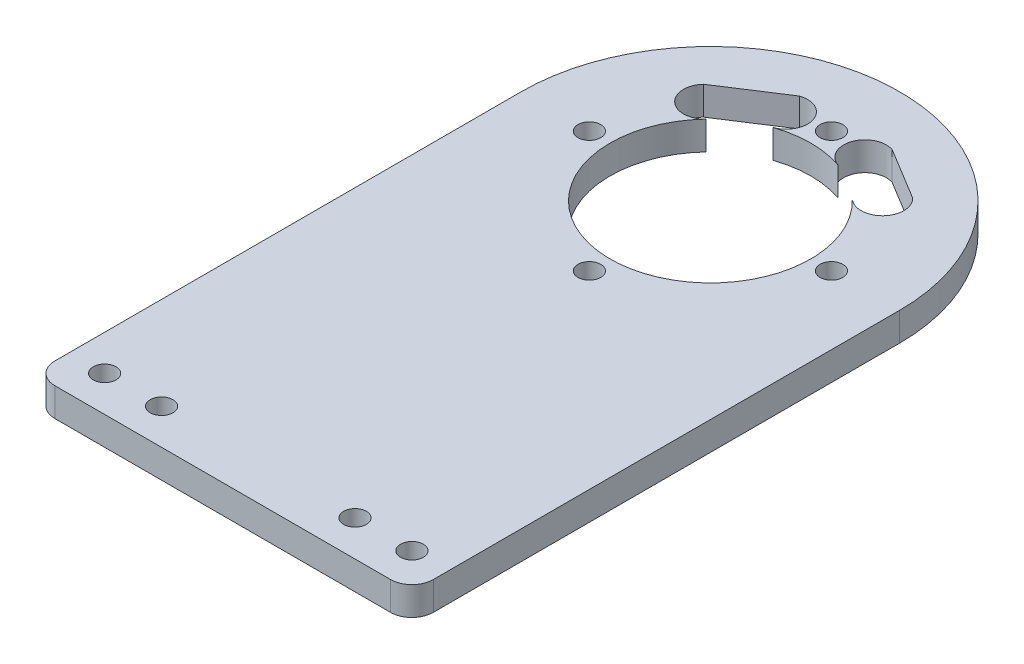
ISO-10303-21;
HEADER;
FILE_DESCRIPTION(('STEP AP214'),'2;1');
FILE_NAME('part.step','',(''),(''),'','','');
FILE_SCHEMA(('AUTOMOTIVE_DESIGN { 1 0 10303 214 1 1 1 1 }'));
ENDSEC;
DATA;
#1=APPLICATION_CONTEXT('core data for automotive mechanical design processes');
#2=APPLICATION_PROTOCOL_DEFINITION('international standard','automotive_design',2000,#1);
#3=PRODUCT_CONTEXT('',#1,'mechanical');
#4=PRODUCT('Part','Part','',(#3));
#5=PRODUCT_RELATED_PRODUCT_CATEGORY('part','',(#4));
#6=PRODUCT_DEFINITION_FORMATION('','',#4);
#7=PRODUCT_DEFINITION_CONTEXT('part definition',#1,'design');
#8=PRODUCT_DEFINITION('design','',#6,#7);
#9=PRODUCT_DEFINITION_SHAPE('','',#8);
#10=(LENGTH_UNIT() NAMED_UNIT(*) SI_UNIT(.MILLI.,.METRE.));
#11=(NAMED_UNIT(*) PLANE_ANGLE_UNIT() SI_UNIT($,.RADIAN.));
#12=(NAMED_UNIT(*) SI_UNIT($,.STERADIAN.) SOLID_ANGLE_UNIT());
#13=UNCERTAINTY_MEASURE_WITH_UNIT(LENGTH_MEASURE(1.E-05),#10,'distance_accuracy_value','');
#14=(GEOMETRIC_REPRESENTATION_CONTEXT(3) GLOBAL_UNCERTAINTY_ASSIGNED_CONTEXT((#13)) GLOBAL_UNIT_ASSIGNED_CONTEXT((#10,
#11,#12)) REPRESENTATION_CONTEXT('',''));
#15=CARTESIAN_POINT('',(0.,0.,0.));
#16=DIRECTION('',(0.,0.,1.));
#17=DIRECTION('',(1.,0.,0.));
#18=AXIS2_PLACEMENT_3D('',#15,#16,#17);
#19=CARTESIAN_POINT('',(0.,4.,0.));
#20=DIRECTION('',(0.,-1.,0.));
#21=DIRECTION('',(0.,0.,-1.));
#22=AXIS2_PLACEMENT_3D('',#19,#20,#21);
#23=PLANE('',#22);
#24=CARTESIAN_POINT('',(13.5802958728512,4.,63.5044260639932));
#25=DIRECTION('',(0.,-1.,0.));
#26=DIRECTION('',(0.,0.,-1.));
#27=AXIS2_PLACEMENT_3D('',#24,#25,#26);
#28=CIRCLE('',#27,1.6);
#29=CARTESIAN_POINT('',(13.5802958728512,4.,61.9044260639932));
#30=VERTEX_POINT('',#29);
#31=EDGE_CURVE('E496',#30,#30,#28,.T.);
#32=ORIENTED_EDGE('',*,*,#31,.T.);
#33=EDGE_LOOP('',(#32));
#34=FACE_BOUND('',#33,.T.);
#35=CARTESIAN_POINT('',(-13.5802958728512,4.,63.5044260639932));
#36=DIRECTION('',(0.,-1.,0.));
#37=DIRECTION('',(0.,0.,-1.));
#38=AXIS2_PLACEMENT_3D('',#35,#36,#37);
#39=CIRCLE('',#38,1.6);
#40=CARTESIAN_POINT('',(-13.5802958728512,4.,61.9044260639932));
#41=VERTEX_POINT('',#40);
#42=EDGE_CURVE('E498',#41,#41,#39,.T.);
#43=ORIENTED_EDGE('',*,*,#42,.T.);
#44=EDGE_LOOP('',(#43));
#45=FACE_BOUND('',#44,.T.);
#46=CARTESIAN_POINT('',(-21.5802958728512,4.,63.5044260639932));
#47=DIRECTION('',(0.,-1.,0.));
#48=DIRECTION('',(0.,0.,-1.));
#49=AXIS2_PLACEMENT_3D('',#46,#47,#48);
#50=CIRCLE('',#49,1.6);
#51=CARTESIAN_POINT('',(-21.5802958728512,4.,61.9044260639932));
#52=VERTEX_POINT('',#51);
#53=EDGE_CURVE('E504',#52,#52,#50,.T.);
#54=ORIENTED_EDGE('',*,*,#53,.T.);
#55=EDGE_LOOP('',(#54));
#56=FACE_BOUND('',#55,.T.);
#57=CARTESIAN_POINT('',(21.5802958728512,4.,63.5044260639932));
#58=DIRECTION('',(0.,-1.,0.));
#59=DIRECTION('',(0.,0.,-1.));
#60=AXIS2_PLACEMENT_3D('',#57,#58,#59);
#61=CIRCLE('',#60,1.6);
#62=CARTESIAN_POINT('',(21.5802958728512,4.,61.9044260639932));
#63=VERTEX_POINT('',#62);
#64=EDGE_CURVE('E501',#63,#63,#61,.T.);
#65=ORIENTED_EDGE('',*,*,#64,.T.);
#66=EDGE_LOOP('',(#65));
#67=FACE_BOUND('',#66,.T.);
#68=DIRECTION('',(0.,0.,1.));
#69=VECTOR('',#68,1.);
#70=CARTESIAN_POINT('',(-26.5802958728512,4.,0.));
#71=LINE('',#70,#69);
#72=CARTESIAN_POINT('',(-26.5802958728512,4.,0.));
#73=VERTEX_POINT('',#72);
#74=CARTESIAN_POINT('',(-26.5802958728512,4.,65.5044260639932));
#75=VERTEX_POINT('',#74);
#76=EDGE_CURVE('E219',#73,#75,#71,.T.);
#77=ORIENTED_EDGE('',*,*,#76,.T.);
#78=CARTESIAN_POINT('',(-23.5802958728512,4.,65.5044260639932));
#79=DIRECTION('',(0.,-1.,0.));
#80=DIRECTION('',(0.,0.,-1.));
#81=AXIS2_PLACEMENT_3D('',#78,#79,#80);
#82=CIRCLE('',#81,3.);
#83=CARTESIAN_POINT('',(-23.5802958728512,4.,68.5044260639932));
#84=VERTEX_POINT('',#83);
#85=EDGE_CURVE('E42',#75,#84,#82,.F.);
#86=ORIENTED_EDGE('',*,*,#85,.T.);
#87=DIRECTION('',(1.,0.,0.));
#88=VECTOR('',#87,1.);
#89=CARTESIAN_POINT('',(-26.5802958728512,4.,68.5044260639932));
#90=LINE('',#89,#88);
#91=CARTESIAN_POINT('',(23.5802958728512,4.,68.5044260639932));
#92=VERTEX_POINT('',#91);
#93=EDGE_CURVE('E212',#84,#92,#90,.T.);
#94=ORIENTED_EDGE('',*,*,#93,.T.);
#95=CARTESIAN_POINT('',(23.5802958728512,4.,65.5044260639932));
#96=DIRECTION('',(0.,-1.,0.));
#97=DIRECTION('',(0.,0.,-1.));
#98=AXIS2_PLACEMENT_3D('',#95,#96,#97);
#99=CIRCLE('',#98,3.);
#100=CARTESIAN_POINT('',(26.5802958728512,4.,65.5044260639932));
#101=VERTEX_POINT('',#100);
#102=EDGE_CURVE('E49',#92,#101,#99,.F.);
#103=ORIENTED_EDGE('',*,*,#102,.T.);
#104=DIRECTION('',(0.,0.,-1.));
#105=VECTOR('',#104,1.);
#106=CARTESIAN_POINT('',(26.5802958728512,4.,0.));
#107=LINE('',#106,#105);
#108=CARTESIAN_POINT('',(26.5802958728512,4.,0.));
#109=VERTEX_POINT('',#108);
#110=EDGE_CURVE('E214',#101,#109,#107,.T.);
#111=ORIENTED_EDGE('',*,*,#110,.T.);
#112=CARTESIAN_POINT('',(0.,4.,0.));
#113=DIRECTION('',(0.,1.,0.));
#114=DIRECTION('',(0.,0.,-1.));
#115=AXIS2_PLACEMENT_3D('',#112,#113,#114);
#116=CIRCLE('',#115,26.5802958728512);
#117=EDGE_CURVE('E217',#109,#73,#116,.T.);
#118=ORIENTED_EDGE('',*,*,#117,.T.);
#119=EDGE_LOOP('',(#77,#86,#94,#103,#111,#118));
#120=FACE_BOUND('',#119,.T.);
#121=CARTESIAN_POINT('',(5.53094890143486,4.,-16.1807877661937));
#122=DIRECTION('',(0.,1.,0.));
#123=DIRECTION('',(0.,0.,1.));
#124=AXIS2_PLACEMENT_3D('',#121,#122,#123);
#125=CIRCLE('',#124,2.99997919545189);
#126=CARTESIAN_POINT('',(6.51515050192705,4.,-19.0147289057964));
#127=VERTEX_POINT('',#126);
#128=CARTESIAN_POINT('',(4.56061253752716,4.,-13.3420693028687));
#129=VERTEX_POINT('',#128);
#130=EDGE_CURVE('E139',#127,#129,#125,.T.);
#131=ORIENTED_EDGE('',*,*,#130,.F.);
#132=DIRECTION('',(-0.85489935738597,0.,-0.518793878858508));
#133=VECTOR('',#132,1.);
#134=CARTESIAN_POINT('',(6.51515050192705,4.,-19.0147289057964));
#135=LINE('',#134,#133);
#136=CARTESIAN_POINT('',(13.857784145601,4.,-14.5588671062434));
#137=VERTEX_POINT('',#136);
#138=EDGE_CURVE('E177',#137,#127,#135,.T.);
#139=ORIENTED_EDGE('',*,*,#138,.F.);
#140=CARTESIAN_POINT('',(11.7643804813229,4.,-12.41002177176));
#141=DIRECTION('',(0.,1.,0.));
#142=DIRECTION('',(0.,0.,-1.));
#143=AXIS2_PLACEMENT_3D('',#140,#141,#142);
#144=CIRCLE('',#143,2.99997919545189);
#145=CARTESIAN_POINT('',(9.70046588306793,4.,-10.2328374193786));
#146=VERTEX_POINT('',#145);
#147=EDGE_CURVE('E174',#146,#137,#144,.T.);
#148=ORIENTED_EDGE('',*,*,#147,.F.);
#149=CARTESIAN_POINT('',(0.,4.,0.));
#150=DIRECTION('',(0.,1.,0.));
#151=DIRECTION('',(0.,0.,1.));
#152=AXIS2_PLACEMENT_3D('',#149,#150,#151);
#153=CIRCLE('',#152,14.1);
#154=CARTESIAN_POINT('',(-10.2865397834997,4.,-9.64350036462274));
#155=VERTEX_POINT('',#154);
#156=EDGE_CURVE('E172',#155,#146,#153,.T.);
#157=ORIENTED_EDGE('',*,*,#156,.F.);
#158=CARTESIAN_POINT('',(-12.4751500915626,4.,-11.6952947238569));
#159=DIRECTION('',(0.,1.,0.));
#160=DIRECTION('',(0.,0.,1.));
#161=AXIS2_PLACEMENT_3D('',#158,#159,#160);
#162=CIRCLE('',#161,2.99997919545189);
#163=CARTESIAN_POINT('',(-14.6950262611692,4.,-13.7132206305136));
#164=VERTEX_POINT('',#163);
#165=EDGE_CURVE('E170',#164,#155,#162,.T.);
#166=ORIENTED_EDGE('',*,*,#165,.F.);
#167=DIRECTION('',(-0.839165303086085,0.,0.54387645113246));
#168=VECTOR('',#167,1.);
#169=CARTESIAN_POINT('',(-14.6950262611692,4.,-13.7132206305136));
#170=LINE('',#169,#168);
#171=CARTESIAN_POINT('',(-6.51515050192706,4.,-19.0147289057964));
#172=VERTEX_POINT('',#171);
#173=EDGE_CURVE('E165',#172,#164,#170,.T.);
#174=ORIENTED_EDGE('',*,*,#173,.F.);
#175=CARTESIAN_POINT('',(-5.53094890143486,4.,-16.1807877661937));
#176=DIRECTION('',(0.,1.,0.));
#177=DIRECTION('',(0.,0.,-1.));
#178=AXIS2_PLACEMENT_3D('',#175,#176,#177);
#179=CIRCLE('',#178,2.99997919545189);
#180=CARTESIAN_POINT('',(-4.56061253752716,4.,-13.3420693028687));
#181=VERTEX_POINT('',#180);
#182=EDGE_CURVE('E163',#181,#172,#179,.T.);
#183=ORIENTED_EDGE('',*,*,#182,.F.);
#184=CARTESIAN_POINT('',(0.,4.,0.));
#185=DIRECTION('',(0.,1.,0.));
#186=DIRECTION('',(0.,0.,-1.));
#187=AXIS2_PLACEMENT_3D('',#184,#185,#186);
#188=CIRCLE('',#187,14.1);
#189=EDGE_CURVE('E149',#129,#181,#188,.T.);
#190=ORIENTED_EDGE('',*,*,#189,.F.);
#191=EDGE_LOOP('',(#131,#139,#148,#157,#166,#174,#183,#190));
#192=FACE_BOUND('',#191,.T.);
#193=CARTESIAN_POINT('',(0.,4.,-17.));
#194=DIRECTION('',(0.,1.,0.));
#195=DIRECTION('',(0.,0.,1.));
#196=AXIS2_PLACEMENT_3D('',#193,#194,#195);
#197=CIRCLE('',#196,1.6);
#198=CARTESIAN_POINT('',(0.,4.,-15.4));
#199=VERTEX_POINT('',#198);
#200=EDGE_CURVE('E181',#199,#199,#197,.T.);
#201=ORIENTED_EDGE('',*,*,#200,.F.);
#202=EDGE_LOOP('',(#201));
#203=FACE_BOUND('',#202,.T.);
#204=CARTESIAN_POINT('',(17.,4.,0.));
#205=DIRECTION('',(0.,1.,0.));
#206=DIRECTION('',(0.,0.,1.));
#207=AXIS2_PLACEMENT_3D('',#204,#205,#206);
#208=CIRCLE('',#207,1.6);
#209=CARTESIAN_POINT('',(17.,4.,1.6));
#210=VERTEX_POINT('',#209);
#211=EDGE_CURVE('E523',#210,#210,#208,.T.);
#212=ORIENTED_EDGE('',*,*,#211,.F.);
#213=EDGE_LOOP('',(#212));
#214=FACE_BOUND('',#213,.T.);
#215=CARTESIAN_POINT('',(-17.,4.,0.));
#216=DIRECTION('',(0.,1.,0.));
#217=DIRECTION('',(0.,0.,-1.));
#218=AXIS2_PLACEMENT_3D('',#215,#216,#217);
#219=CIRCLE('',#218,1.6);
#220=CARTESIAN_POINT('',(-17.,4.,-1.6));
#221=VERTEX_POINT('',#220);
#222=EDGE_CURVE('E517',#221,#221,#219,.T.);
#223=ORIENTED_EDGE('',*,*,#222,.F.);
#224=EDGE_LOOP('',(#223));
#225=FACE_BOUND('',#224,.T.);
#226=CARTESIAN_POINT('',(0.,4.,17.));
#227=DIRECTION('',(0.,1.,0.));
#228=DIRECTION('',(0.,0.,1.));
#229=AXIS2_PLACEMENT_3D('',#226,#227,#228);
#230=CIRCLE('',#229,1.6);
#231=CARTESIAN_POINT('',(0.,4.,18.6));
#232=VERTEX_POINT('',#231);
#233=EDGE_CURVE('E511',#232,#232,#230,.T.);
#234=ORIENTED_EDGE('',*,*,#233,.F.);
#235=EDGE_LOOP('',(#234));
#236=FACE_BOUND('',#235,.T.);
#237=ADVANCED_FACE('F34',(#34,#45,#56,#67,#120,#192,#203,#214,#225,#236),#23,.F.);
#238=CARTESIAN_POINT('',(0.,0.,0.));
#239=DIRECTION('',(0.,-1.,0.));
#240=DIRECTION('',(0.,0.,-1.));
#241=AXIS2_PLACEMENT_3D('',#238,#239,#240);
#242=PLANE('',#241);
#243=CARTESIAN_POINT('',(13.5802958728512,0.,63.5044260639932));
#244=DIRECTION('',(0.,-1.,0.));
#245=DIRECTION('',(0.,0.,-1.));
#246=AXIS2_PLACEMENT_3D('',#243,#244,#245);
#247=CIRCLE('',#246,1.6);
#248=CARTESIAN_POINT('',(13.5802958728512,0.,61.9044260639932));
#249=VERTEX_POINT('',#248);
#250=EDGE_CURVE('E494',#249,#249,#247,.T.);
#251=ORIENTED_EDGE('',*,*,#250,.F.);
#252=EDGE_LOOP('',(#251));
#253=FACE_BOUND('',#252,.T.);
#254=CARTESIAN_POINT('',(-13.5802958728512,0.,63.5044260639932));
#255=DIRECTION('',(0.,-1.,0.));
#256=DIRECTION('',(0.,0.,1.));
#257=AXIS2_PLACEMENT_3D('',#254,#255,#256);
#258=CIRCLE('',#257,1.6);
#259=CARTESIAN_POINT('',(-13.5802958728512,0.,65.1044260639932));
#260=VERTEX_POINT('',#259);
#261=EDGE_CURVE('E558',#260,#260,#258,.T.);
#262=ORIENTED_EDGE('',*,*,#261,.F.);
#263=EDGE_LOOP('',(#262));
#264=FACE_BOUND('',#263,.T.);
#265=CARTESIAN_POINT('',(-21.5802958728512,0.,63.5044260639932));
#266=DIRECTION('',(0.,-1.,0.));
#267=DIRECTION('',(0.,0.,1.));
#268=AXIS2_PLACEMENT_3D('',#265,#266,#267);
#269=CIRCLE('',#268,1.6);
#270=CARTESIAN_POINT('',(-21.5802958728512,0.,65.1044260639932));
#271=VERTEX_POINT('',#270);
#272=EDGE_CURVE('E555',#271,#271,#269,.T.);
#273=ORIENTED_EDGE('',*,*,#272,.F.);
#274=EDGE_LOOP('',(#273));
#275=FACE_BOUND('',#274,.T.);
#276=CARTESIAN_POINT('',(21.5802958728512,0.,63.5044260639932));
#277=DIRECTION('',(0.,-1.,0.));
#278=DIRECTION('',(0.,0.,-1.));
#279=AXIS2_PLACEMENT_3D('',#276,#277,#278);
#280=CIRCLE('',#279,1.6);
#281=CARTESIAN_POINT('',(21.5802958728512,0.,61.9044260639932));
#282=VERTEX_POINT('',#281);
#283=EDGE_CURVE('E497',#282,#282,#280,.T.);
#284=ORIENTED_EDGE('',*,*,#283,.F.);
#285=EDGE_LOOP('',(#284));
#286=FACE_BOUND('',#285,.T.);
#287=CARTESIAN_POINT('',(-17.,0.,0.));
#288=DIRECTION('',(0.,1.,0.));
#289=DIRECTION('',(0.,0.,-1.));
#290=AXIS2_PLACEMENT_3D('',#287,#288,#289);
#291=CIRCLE('',#290,1.6);
#292=CARTESIAN_POINT('',(-17.,0.,-1.6));
#293=VERTEX_POINT('',#292);
#294=EDGE_CURVE('E514',#293,#293,#291,.T.);
#295=ORIENTED_EDGE('',*,*,#294,.T.);
#296=EDGE_LOOP('',(#295));
#297=FACE_BOUND('',#296,.T.);
#298=CARTESIAN_POINT('',(0.,0.,-17.));
#299=DIRECTION('',(0.,1.,0.));
#300=DIRECTION('',(0.,0.,1.));
#301=AXIS2_PLACEMENT_3D('',#298,#299,#300);
#302=CIRCLE('',#301,1.6);
#303=CARTESIAN_POINT('',(0.,0.,-15.4));
#304=VERTEX_POINT('',#303);
#305=EDGE_CURVE('E526',#304,#304,#302,.T.);
#306=ORIENTED_EDGE('',*,*,#305,.T.);
#307=EDGE_LOOP('',(#306));
#308=FACE_BOUND('',#307,.T.);
#309=DIRECTION('',(1.,0.,0.));
#310=VECTOR('',#309,1.);
#311=CARTESIAN_POINT('',(-26.5802958728512,0.,68.5044260639932));
#312=LINE('',#311,#310);
#313=CARTESIAN_POINT('',(-23.5802958728512,0.,68.5044260639932));
#314=VERTEX_POINT('',#313);
#315=CARTESIAN_POINT('',(23.5802958728512,0.,68.5044260639932));
#316=VERTEX_POINT('',#315);
#317=EDGE_CURVE('E157',#314,#316,#312,.T.);
#318=ORIENTED_EDGE('',*,*,#317,.F.);
#319=CARTESIAN_POINT('',(-23.5802958728512,0.,65.5044260639932));
#320=DIRECTION('',(0.,-1.,0.));
#321=DIRECTION('',(0.,0.,-1.));
#322=AXIS2_PLACEMENT_3D('',#319,#320,#321);
#323=CIRCLE('',#322,3.);
#324=CARTESIAN_POINT('',(-26.5802958728512,0.,65.5044260639932));
#325=VERTEX_POINT('',#324);
#326=EDGE_CURVE('E241',#314,#325,#323,.T.);
#327=ORIENTED_EDGE('',*,*,#326,.T.);
#328=DIRECTION('',(0.,0.,1.));
#329=VECTOR('',#328,1.);
#330=CARTESIAN_POINT('',(-26.5802958728512,0.,0.));
#331=LINE('',#330,#329);
#332=CARTESIAN_POINT('',(-26.5802958728512,0.,0.));
#333=VERTEX_POINT('',#332);
#334=EDGE_CURVE('E215',#333,#325,#331,.T.);
#335=ORIENTED_EDGE('',*,*,#334,.F.);
#336=CARTESIAN_POINT('',(0.,0.,0.));
#337=DIRECTION('',(0.,1.,0.));
#338=DIRECTION('',(0.,0.,-1.));
#339=AXIS2_PLACEMENT_3D('',#336,#337,#338);
#340=CIRCLE('',#339,26.5802958728512);
#341=CARTESIAN_POINT('',(26.5802958728512,0.,0.));
#342=VERTEX_POINT('',#341);
#343=EDGE_CURVE('E226',#342,#333,#340,.T.);
#344=ORIENTED_EDGE('',*,*,#343,.F.);
#345=DIRECTION('',(0.,0.,-1.));
#346=VECTOR('',#345,1.);
#347=CARTESIAN_POINT('',(26.5802958728512,0.,0.));
#348=LINE('',#347,#346);
#349=CARTESIAN_POINT('',(26.5802958728512,0.,65.5044260639932));
#350=VERTEX_POINT('',#349);
#351=EDGE_CURVE('E224',#350,#342,#348,.T.);
#352=ORIENTED_EDGE('',*,*,#351,.F.);
#353=CARTESIAN_POINT('',(23.5802958728512,0.,65.5044260639932));
#354=DIRECTION('',(0.,-1.,0.));
#355=DIRECTION('',(0.,0.,-1.));
#356=AXIS2_PLACEMENT_3D('',#353,#354,#355);
#357=CIRCLE('',#356,3.);
#358=EDGE_CURVE('E239',#350,#316,#357,.T.);
#359=ORIENTED_EDGE('',*,*,#358,.T.);
#360=EDGE_LOOP('',(#318,#327,#335,#344,#352,#359));
#361=FACE_BOUND('',#360,.T.);
#362=DIRECTION('',(-0.85489935738597,0.,-0.518793878858508));
#363=VECTOR('',#362,1.);
#364=CARTESIAN_POINT('',(6.51515050192705,0.,-19.0147289057964));
#365=LINE('',#364,#363);
#366=CARTESIAN_POINT('',(13.857784145601,0.,-14.5588671062434));
#367=VERTEX_POINT('',#366);
#368=CARTESIAN_POINT('',(6.51515050192705,0.,-19.0147289057964));
#369=VERTEX_POINT('',#368);
#370=EDGE_CURVE('E150',#367,#369,#365,.T.);
#371=ORIENTED_EDGE('',*,*,#370,.T.);
#372=CARTESIAN_POINT('',(5.53094890143486,0.,-16.1807877661937));
#373=DIRECTION('',(0.,1.,0.));
#374=DIRECTION('',(0.,0.,1.));
#375=AXIS2_PLACEMENT_3D('',#372,#373,#374);
#376=CIRCLE('',#375,2.99997919545189);
#377=CARTESIAN_POINT('',(4.56061253752716,0.,-13.3420693028687));
#378=VERTEX_POINT('',#377);
#379=EDGE_CURVE('E179',#369,#378,#376,.T.);
#380=ORIENTED_EDGE('',*,*,#379,.T.);
#381=CARTESIAN_POINT('',(0.,0.,0.));
#382=DIRECTION('',(0.,1.,0.));
#383=DIRECTION('',(0.,0.,-1.));
#384=AXIS2_PLACEMENT_3D('',#381,#382,#383);
#385=CIRCLE('',#384,14.1);
#386=CARTESIAN_POINT('',(-4.56061253752716,0.,-13.3420693028687));
#387=VERTEX_POINT('',#386);
#388=EDGE_CURVE('E156',#378,#387,#385,.T.);
#389=ORIENTED_EDGE('',*,*,#388,.T.);
#390=CARTESIAN_POINT('',(-5.53094890143486,0.,-16.1807877661937));
#391=DIRECTION('',(0.,1.,0.));
#392=DIRECTION('',(0.,0.,-1.));
#393=AXIS2_PLACEMENT_3D('',#390,#391,#392);
#394=CIRCLE('',#393,2.99997919545189);
#395=CARTESIAN_POINT('',(-6.51515050192706,0.,-19.0147289057964));
#396=VERTEX_POINT('',#395);
#397=EDGE_CURVE('E183',#387,#396,#394,.T.);
#398=ORIENTED_EDGE('',*,*,#397,.T.);
#399=DIRECTION('',(-0.839165303086085,0.,0.54387645113246));
#400=VECTOR('',#399,1.);
#401=CARTESIAN_POINT('',(-14.6950262611692,0.,-13.7132206305136));
#402=LINE('',#401,#400);
#403=CARTESIAN_POINT('',(-14.6950262611692,0.,-13.7132206305136));
#404=VERTEX_POINT('',#403);
#405=EDGE_CURVE('E186',#396,#404,#402,.T.);
#406=ORIENTED_EDGE('',*,*,#405,.T.);
#407=CARTESIAN_POINT('',(-12.4751500915626,0.,-11.6952947238569));
#408=DIRECTION('',(0.,1.,0.));
#409=DIRECTION('',(0.,0.,1.));
#410=AXIS2_PLACEMENT_3D('',#407,#408,#409);
#411=CIRCLE('',#410,2.99997919545189);
#412=CARTESIAN_POINT('',(-10.2865397834997,0.,-9.64350036462274));
#413=VERTEX_POINT('',#412);
#414=EDGE_CURVE('E189',#404,#413,#411,.T.);
#415=ORIENTED_EDGE('',*,*,#414,.T.);
#416=CARTESIAN_POINT('',(0.,0.,0.));
#417=DIRECTION('',(0.,1.,0.));
#418=DIRECTION('',(0.,0.,1.));
#419=AXIS2_PLACEMENT_3D('',#416,#417,#418);
#420=CIRCLE('',#419,14.1);
#421=CARTESIAN_POINT('',(9.70046588306793,0.,-10.2328374193786));
#422=VERTEX_POINT('',#421);
#423=EDGE_CURVE('E192',#413,#422,#420,.T.);
#424=ORIENTED_EDGE('',*,*,#423,.T.);
#425=CARTESIAN_POINT('',(11.7643804813229,0.,-12.41002177176));
#426=DIRECTION('',(0.,1.,0.));
#427=DIRECTION('',(0.,0.,-1.));
#428=AXIS2_PLACEMENT_3D('',#425,#426,#427);
#429=CIRCLE('',#428,2.99997919545189);
#430=EDGE_CURVE('E195',#422,#367,#429,.T.);
#431=ORIENTED_EDGE('',*,*,#430,.T.);
#432=EDGE_LOOP('',(#371,#380,#389,#398,#406,#415,#424,#431));
#433=FACE_BOUND('',#432,.T.);
#434=CARTESIAN_POINT('',(17.,0.,0.));
#435=DIRECTION('',(0.,1.,0.));
#436=DIRECTION('',(0.,0.,1.));
#437=AXIS2_PLACEMENT_3D('',#434,#435,#436);
#438=CIRCLE('',#437,1.6);
#439=CARTESIAN_POINT('',(17.,0.,1.6));
#440=VERTEX_POINT('',#439);
#441=EDGE_CURVE('E520',#440,#440,#438,.T.);
#442=ORIENTED_EDGE('',*,*,#441,.T.);
#443=EDGE_LOOP('',(#442));
#444=FACE_BOUND('',#443,.T.);
#445=CARTESIAN_POINT('',(0.,0.,17.));
#446=DIRECTION('',(0.,1.,0.));
#447=DIRECTION('',(0.,0.,1.));
#448=AXIS2_PLACEMENT_3D('',#445,#446,#447);
#449=CIRCLE('',#448,1.6);
#450=CARTESIAN_POINT('',(0.,0.,18.6));
#451=VERTEX_POINT('',#450);
#452=EDGE_CURVE('E510',#451,#451,#449,.T.);
#453=ORIENTED_EDGE('',*,*,#452,.T.);
#454=EDGE_LOOP('',(#453));
#455=FACE_BOUND('',#454,.T.);
#456=ADVANCED_FACE('F255',(#253,#264,#275,#286,#297,#308,#361,#433,#444,#455),#242,.T.);
#457=CARTESIAN_POINT('',(-26.5802958728512,4.,68.5044260639932));
#458=DIRECTION('',(0.,0.,-1.));
#459=DIRECTION('',(-1.,0.,0.));
#460=AXIS2_PLACEMENT_3D('',#457,#458,#459);
#461=PLANE('',#460);
#462=ORIENTED_EDGE('',*,*,#93,.F.);
#463=DIRECTION('',(0.,-1.,0.));
#464=VECTOR('',#463,1.);
#465=CARTESIAN_POINT('',(-23.5802958728512,4.,68.5044260639932));
#466=LINE('',#465,#464);
#467=EDGE_CURVE('E236',#84,#314,#466,.T.);
#468=ORIENTED_EDGE('',*,*,#467,.T.);
#469=ORIENTED_EDGE('',*,*,#317,.T.);
#470=DIRECTION('',(0.,-1.,0.));
#471=VECTOR('',#470,1.);
#472=CARTESIAN_POINT('',(23.5802958728512,4.,68.5044260639932));
#473=LINE('',#472,#471);
#474=EDGE_CURVE('E234',#316,#92,#473,.F.);
#475=ORIENTED_EDGE('',*,*,#474,.T.);
#476=EDGE_LOOP('',(#462,#468,#469,#475));
#477=FACE_BOUND('',#476,.T.);
#478=ADVANCED_FACE('F249',(#477),#461,.F.);
#479=CARTESIAN_POINT('',(26.5802958728512,4.,0.));
#480=DIRECTION('',(-1.,0.,0.));
#481=DIRECTION('',(0.,0.,1.));
#482=AXIS2_PLACEMENT_3D('',#479,#480,#481);
#483=PLANE('',#482);
#484=ORIENTED_EDGE('',*,*,#110,.F.);
#485=DIRECTION('',(0.,-1.,0.));
#486=VECTOR('',#485,1.);
#487=CARTESIAN_POINT('',(26.5802958728512,4.,65.5044260639932));
#488=LINE('',#487,#486);
#489=EDGE_CURVE('E11',#101,#350,#488,.T.);
#490=ORIENTED_EDGE('',*,*,#489,.T.);
#491=ORIENTED_EDGE('',*,*,#351,.T.);
#492=DIRECTION('',(0.,-1.,0.));
#493=VECTOR('',#492,1.);
#494=CARTESIAN_POINT('',(26.5802958728512,4.,0.));
#495=LINE('',#494,#493);
#496=EDGE_CURVE('E231',#109,#342,#495,.T.);
#497=ORIENTED_EDGE('',*,*,#496,.F.);
#498=EDGE_LOOP('',(#484,#490,#491,#497));
#499=FACE_BOUND('',#498,.T.);
#500=ADVANCED_FACE('F266',(#499),#483,.F.);
#501=CARTESIAN_POINT('',(0.,4.,0.));
#502=DIRECTION('',(0.,-1.,0.));
#503=DIRECTION('',(0.,0.,-1.));
#504=AXIS2_PLACEMENT_3D('',#501,#502,#503);
#505=CYLINDRICAL_SURFACE('',#504,26.5802958728512);
#506=ORIENTED_EDGE('',*,*,#343,.T.);
#507=DIRECTION('',(0.,-1.,0.));
#508=VECTOR('',#507,1.);
#509=CARTESIAN_POINT('',(-26.5802958728512,4.,0.));
#510=LINE('',#509,#508);
#511=EDGE_CURVE('E221',#73,#333,#510,.T.);
#512=ORIENTED_EDGE('',*,*,#511,.F.);
#513=ORIENTED_EDGE('',*,*,#117,.F.);
#514=ORIENTED_EDGE('',*,*,#496,.T.);
#515=EDGE_LOOP('',(#506,#512,#513,#514));
#516=FACE_BOUND('',#515,.T.);
#517=ADVANCED_FACE('F262',(#516),#505,.T.);
#518=CARTESIAN_POINT('',(-26.5802958728512,4.,0.));
#519=DIRECTION('',(1.,0.,0.));
#520=DIRECTION('',(0.,0.,-1.));
#521=AXIS2_PLACEMENT_3D('',#518,#519,#520);
#522=PLANE('',#521);
#523=ORIENTED_EDGE('',*,*,#334,.T.);
#524=DIRECTION('',(0.,-1.,0.));
#525=VECTOR('',#524,1.);
#526=CARTESIAN_POINT('',(-26.5802958728512,4.,65.5044260639932));
#527=LINE('',#526,#525);
#528=EDGE_CURVE('E57',#325,#75,#527,.F.);
#529=ORIENTED_EDGE('',*,*,#528,.T.);
#530=ORIENTED_EDGE('',*,*,#76,.F.);
#531=ORIENTED_EDGE('',*,*,#511,.T.);
#532=EDGE_LOOP('',(#523,#529,#530,#531));
#533=FACE_BOUND('',#532,.T.);
#534=ADVANCED_FACE('F258',(#533),#522,.F.);
#535=CARTESIAN_POINT('',(5.53094890143486,4.,-16.1807877661937));
#536=DIRECTION('',(0.,-1.,0.));
#537=DIRECTION('',(0.,0.,-1.));
#538=AXIS2_PLACEMENT_3D('',#535,#536,#537);
#539=CYLINDRICAL_SURFACE('',#538,2.99997919545189);
#540=ORIENTED_EDGE('',*,*,#379,.F.);
#541=DIRECTION('',(0.,-1.,0.));
#542=VECTOR('',#541,1.);
#543=CARTESIAN_POINT('',(6.51515050192705,4.,-19.0147289057964));
#544=LINE('',#543,#542);
#545=EDGE_CURVE('E145',#127,#369,#544,.T.);
#546=ORIENTED_EDGE('',*,*,#545,.F.);
#547=ORIENTED_EDGE('',*,*,#130,.T.);
#548=DIRECTION('',(0.,-1.,0.));
#549=VECTOR('',#548,1.);
#550=CARTESIAN_POINT('',(4.56061253752716,4.,-13.3420693028687));
#551=LINE('',#550,#549);
#552=EDGE_CURVE('E142',#129,#378,#551,.T.);
#553=ORIENTED_EDGE('',*,*,#552,.T.);
#554=EDGE_LOOP('',(#540,#546,#547,#553));
#555=FACE_BOUND('',#554,.T.);
#556=ADVANCED_FACE('F141',(#555),#539,.F.);
#557=CARTESIAN_POINT('',(0.,4.,0.));
#558=DIRECTION('',(0.,-1.,0.));
#559=DIRECTION('',(0.,0.,-1.));
#560=AXIS2_PLACEMENT_3D('',#557,#558,#559);
#561=CYLINDRICAL_SURFACE('',#560,14.1);
#562=ORIENTED_EDGE('',*,*,#388,.F.);
#563=ORIENTED_EDGE('',*,*,#552,.F.);
#564=ORIENTED_EDGE('',*,*,#189,.T.);
#565=DIRECTION('',(0.,-1.,0.));
#566=VECTOR('',#565,1.);
#567=CARTESIAN_POINT('',(-4.56061253752716,4.,-13.3420693028687));
#568=LINE('',#567,#566);
#569=EDGE_CURVE('E158',#181,#387,#568,.T.);
#570=ORIENTED_EDGE('',*,*,#569,.T.);
#571=EDGE_LOOP('',(#562,#563,#564,#570));
#572=FACE_BOUND('',#571,.T.);
#573=ADVANCED_FACE('F153',(#572),#561,.F.);
#574=CARTESIAN_POINT('',(-5.53094890143486,4.,-16.1807877661937));
#575=DIRECTION('',(0.,-1.,0.));
#576=DIRECTION('',(0.,0.,-1.));
#577=AXIS2_PLACEMENT_3D('',#574,#575,#576);
#578=CYLINDRICAL_SURFACE('',#577,2.99997919545189);
#579=ORIENTED_EDGE('',*,*,#397,.F.);
#580=ORIENTED_EDGE('',*,*,#569,.F.);
#581=ORIENTED_EDGE('',*,*,#182,.T.);
#582=DIRECTION('',(0.,-1.,0.));
#583=VECTOR('',#582,1.);
#584=CARTESIAN_POINT('',(-6.51515050192706,4.,-19.0147289057964));
#585=LINE('',#584,#583);
#586=EDGE_CURVE('E209',#172,#396,#585,.T.);
#587=ORIENTED_EDGE('',*,*,#586,.T.);
#588=EDGE_LOOP('',(#579,#580,#581,#587));
#589=FACE_BOUND('',#588,.T.);
#590=ADVANCED_FACE('F322',(#589),#578,.F.);
#591=CARTESIAN_POINT('',(-14.6950262611692,4.,-13.7132206305136));
#592=DIRECTION('',(0.54387645113246,0.,0.839165303086085));
#593=DIRECTION('',(0.839165303086085,0.,-0.54387645113246));
#594=AXIS2_PLACEMENT_3D('',#591,#592,#593);
#595=PLANE('',#594);
#596=ORIENTED_EDGE('',*,*,#405,.F.);
#597=ORIENTED_EDGE('',*,*,#586,.F.);
#598=ORIENTED_EDGE('',*,*,#173,.T.);
#599=DIRECTION('',(0.,-1.,0.));
#600=VECTOR('',#599,1.);
#601=CARTESIAN_POINT('',(-14.6950262611692,4.,-13.7132206305136));
#602=LINE('',#601,#600);
#603=EDGE_CURVE('E207',#164,#404,#602,.T.);
#604=ORIENTED_EDGE('',*,*,#603,.T.);
#605=EDGE_LOOP('',(#596,#597,#598,#604));
#606=FACE_BOUND('',#605,.T.);
#607=ADVANCED_FACE('F328',(#606),#595,.T.);
#608=CARTESIAN_POINT('',(-12.4751500915626,4.,-11.6952947238569));
#609=DIRECTION('',(0.,-1.,0.));
#610=DIRECTION('',(0.,0.,-1.));
#611=AXIS2_PLACEMENT_3D('',#608,#609,#610);
#612=CYLINDRICAL_SURFACE('',#611,2.99997919545189);
#613=ORIENTED_EDGE('',*,*,#414,.F.);
#614=ORIENTED_EDGE('',*,*,#603,.F.);
#615=ORIENTED_EDGE('',*,*,#165,.T.);
#616=DIRECTION('',(0.,-1.,0.));
#617=VECTOR('',#616,1.);
#618=CARTESIAN_POINT('',(-10.2865397834997,4.,-9.64350036462274));
#619=LINE('',#618,#617);
#620=EDGE_CURVE('E205',#155,#413,#619,.T.);
#621=ORIENTED_EDGE('',*,*,#620,.T.);
#622=EDGE_LOOP('',(#613,#614,#615,#621));
#623=FACE_BOUND('',#622,.T.);
#624=ADVANCED_FACE('F336',(#623),#612,.F.);
#625=CARTESIAN_POINT('',(0.,4.,0.));
#626=DIRECTION('',(0.,-1.,0.));
#627=DIRECTION('',(0.,0.,-1.));
#628=AXIS2_PLACEMENT_3D('',#625,#626,#627);
#629=CYLINDRICAL_SURFACE('',#628,14.1);
#630=ORIENTED_EDGE('',*,*,#423,.F.);
#631=ORIENTED_EDGE('',*,*,#620,.F.);
#632=ORIENTED_EDGE('',*,*,#156,.T.);
#633=DIRECTION('',(0.,-1.,0.));
#634=VECTOR('',#633,1.);
#635=CARTESIAN_POINT('',(9.70046588306793,4.,-10.2328374193786));
#636=LINE('',#635,#634);
#637=EDGE_CURVE('E203',#146,#422,#636,.T.);
#638=ORIENTED_EDGE('',*,*,#637,.T.);
#639=EDGE_LOOP('',(#630,#631,#632,#638));
#640=FACE_BOUND('',#639,.T.);
#641=ADVANCED_FACE('F344',(#640),#629,.F.);
#642=CARTESIAN_POINT('',(11.7643804813229,4.,-12.41002177176));
#643=DIRECTION('',(0.,-1.,0.));
#644=DIRECTION('',(0.,0.,-1.));
#645=AXIS2_PLACEMENT_3D('',#642,#643,#644);
#646=CYLINDRICAL_SURFACE('',#645,2.99997919545189);
#647=ORIENTED_EDGE('',*,*,#430,.F.);
#648=ORIENTED_EDGE('',*,*,#637,.F.);
#649=ORIENTED_EDGE('',*,*,#147,.T.);
#650=DIRECTION('',(0.,-1.,0.));
#651=VECTOR('',#650,1.);
#652=CARTESIAN_POINT('',(13.857784145601,4.,-14.5588671062434));
#653=LINE('',#652,#651);
#654=EDGE_CURVE('E201',#137,#367,#653,.T.);
#655=ORIENTED_EDGE('',*,*,#654,.T.);
#656=EDGE_LOOP('',(#647,#648,#649,#655));
#657=FACE_BOUND('',#656,.T.);
#658=ADVANCED_FACE('F352',(#657),#646,.F.);
#659=CARTESIAN_POINT('',(6.51515050192705,4.,-19.0147289057964));
#660=DIRECTION('',(-0.518793878858508,0.,0.85489935738597));
#661=DIRECTION('',(0.85489935738597,0.,0.518793878858508));
#662=AXIS2_PLACEMENT_3D('',#659,#660,#661);
#663=PLANE('',#662);
#664=ORIENTED_EDGE('',*,*,#370,.F.);
#665=ORIENTED_EDGE('',*,*,#654,.F.);
#666=ORIENTED_EDGE('',*,*,#138,.T.);
#667=ORIENTED_EDGE('',*,*,#545,.T.);
#668=EDGE_LOOP('',(#664,#665,#666,#667));
#669=FACE_BOUND('',#668,.T.);
#670=ADVANCED_FACE('F360',(#669),#663,.T.);
#671=CARTESIAN_POINT('',(0.,4.,-17.));
#672=DIRECTION('',(0.,-1.,0.));
#673=DIRECTION('',(0.,0.,-1.));
#674=AXIS2_PLACEMENT_3D('',#671,#672,#673);
#675=CYLINDRICAL_SURFACE('',#674,1.6);
#676=ORIENTED_EDGE('',*,*,#200,.T.);
#677=EDGE_LOOP('',(#676));
#678=FACE_BOUND('',#677,.T.);
#679=ORIENTED_EDGE('',*,*,#305,.F.);
#680=EDGE_LOOP('',(#679));
#681=FACE_BOUND('',#680,.T.);
#682=ADVANCED_FACE('F368',(#678,#681),#675,.F.);
#683=CARTESIAN_POINT('',(17.,4.,0.));
#684=DIRECTION('',(0.,-1.,0.));
#685=DIRECTION('',(0.,0.,-1.));
#686=AXIS2_PLACEMENT_3D('',#683,#684,#685);
#687=CYLINDRICAL_SURFACE('',#686,1.6);
#688=ORIENTED_EDGE('',*,*,#211,.T.);
#689=EDGE_LOOP('',(#688));
#690=FACE_BOUND('',#689,.T.);
#691=ORIENTED_EDGE('',*,*,#441,.F.);
#692=EDGE_LOOP('',(#691));
#693=FACE_BOUND('',#692,.T.);
#694=ADVANCED_FACE('F376',(#690,#693),#687,.F.);
#695=CARTESIAN_POINT('',(-17.,4.,0.));
#696=DIRECTION('',(0.,-1.,0.));
#697=DIRECTION('',(0.,0.,-1.));
#698=AXIS2_PLACEMENT_3D('',#695,#696,#697);
#699=CYLINDRICAL_SURFACE('',#698,1.6);
#700=ORIENTED_EDGE('',*,*,#222,.T.);
#701=EDGE_LOOP('',(#700));
#702=FACE_BOUND('',#701,.T.);
#703=ORIENTED_EDGE('',*,*,#294,.F.);
#704=EDGE_LOOP('',(#703));
#705=FACE_BOUND('',#704,.T.);
#706=ADVANCED_FACE('F384',(#702,#705),#699,.F.);
#707=CARTESIAN_POINT('',(0.,4.,17.));
#708=DIRECTION('',(0.,-1.,0.));
#709=DIRECTION('',(0.,0.,-1.));
#710=AXIS2_PLACEMENT_3D('',#707,#708,#709);
#711=CYLINDRICAL_SURFACE('',#710,1.6);
#712=ORIENTED_EDGE('',*,*,#233,.T.);
#713=EDGE_LOOP('',(#712));
#714=FACE_BOUND('',#713,.T.);
#715=ORIENTED_EDGE('',*,*,#452,.F.);
#716=EDGE_LOOP('',(#715));
#717=FACE_BOUND('',#716,.T.);
#718=ADVANCED_FACE('F392',(#714,#717),#711,.F.);
#719=CARTESIAN_POINT('',(21.5802958728512,10.,63.5044260639932));
#720=DIRECTION('',(0.,-1.,0.));
#721=DIRECTION('',(0.,0.,-1.));
#722=AXIS2_PLACEMENT_3D('',#719,#720,#721);
#723=CYLINDRICAL_SURFACE('',#722,1.6);
#724=ORIENTED_EDGE('',*,*,#283,.T.);
#725=EDGE_LOOP('',(#724));
#726=FACE_BOUND('',#725,.T.);
#727=ORIENTED_EDGE('',*,*,#64,.F.);
#728=EDGE_LOOP('',(#727));
#729=FACE_BOUND('',#728,.T.);
#730=ADVANCED_FACE('F400',(#726,#729),#723,.F.);
#731=CARTESIAN_POINT('',(-21.5802958728512,10.,63.5044260639932));
#732=DIRECTION('',(0.,-1.,0.));
#733=DIRECTION('',(0.,0.,-1.));
#734=AXIS2_PLACEMENT_3D('',#731,#732,#733);
#735=CYLINDRICAL_SURFACE('',#734,1.6);
#736=ORIENTED_EDGE('',*,*,#272,.T.);
#737=EDGE_LOOP('',(#736));
#738=FACE_BOUND('',#737,.T.);
#739=ORIENTED_EDGE('',*,*,#53,.F.);
#740=EDGE_LOOP('',(#739));
#741=FACE_BOUND('',#740,.T.);
#742=ADVANCED_FACE('F408',(#738,#741),#735,.F.);
#743=CARTESIAN_POINT('',(-13.5802958728512,10.,63.5044260639932));
#744=DIRECTION('',(0.,-1.,0.));
#745=DIRECTION('',(0.,0.,-1.));
#746=AXIS2_PLACEMENT_3D('',#743,#744,#745);
#747=CYLINDRICAL_SURFACE('',#746,1.6);
#748=ORIENTED_EDGE('',*,*,#261,.T.);
#749=EDGE_LOOP('',(#748));
#750=FACE_BOUND('',#749,.T.);
#751=ORIENTED_EDGE('',*,*,#42,.F.);
#752=EDGE_LOOP('',(#751));
#753=FACE_BOUND('',#752,.T.);
#754=ADVANCED_FACE('F416',(#750,#753),#747,.F.);
#755=CARTESIAN_POINT('',(13.5802958728512,10.,63.5044260639932));
#756=DIRECTION('',(0.,-1.,0.));
#757=DIRECTION('',(0.,0.,-1.));
#758=AXIS2_PLACEMENT_3D('',#755,#756,#757);
#759=CYLINDRICAL_SURFACE('',#758,1.6);
#760=ORIENTED_EDGE('',*,*,#250,.T.);
#761=EDGE_LOOP('',(#760));
#762=FACE_BOUND('',#761,.T.);
#763=ORIENTED_EDGE('',*,*,#31,.F.);
#764=EDGE_LOOP('',(#763));
#765=FACE_BOUND('',#764,.T.);
#766=ADVANCED_FACE('F273',(#762,#765),#759,.F.);
#767=CARTESIAN_POINT('',(-23.5802958728512,4.,65.5044260639932));
#768=DIRECTION('',(0.,-1.,0.));
#769=DIRECTION('',(0.,0.,-1.));
#770=AXIS2_PLACEMENT_3D('',#767,#768,#769);
#771=CYLINDRICAL_SURFACE('',#770,3.);
#772=ORIENTED_EDGE('',*,*,#85,.F.);
#773=ORIENTED_EDGE('',*,*,#528,.F.);
#774=ORIENTED_EDGE('',*,*,#326,.F.);
#775=ORIENTED_EDGE('',*,*,#467,.F.);
#776=EDGE_LOOP('',(#772,#773,#774,#775));
#777=FACE_BOUND('',#776,.T.);
#778=ADVANCED_FACE('F252',(#777),#771,.T.);
#779=CARTESIAN_POINT('',(23.5802958728512,4.,65.5044260639932));
#780=DIRECTION('',(0.,-1.,0.));
#781=DIRECTION('',(0.,0.,-1.));
#782=AXIS2_PLACEMENT_3D('',#779,#780,#781);
#783=CYLINDRICAL_SURFACE('',#782,3.);
#784=ORIENTED_EDGE('',*,*,#102,.F.);
#785=ORIENTED_EDGE('',*,*,#474,.F.);
#786=ORIENTED_EDGE('',*,*,#358,.F.);
#787=ORIENTED_EDGE('',*,*,#489,.F.);
#788=EDGE_LOOP('',(#784,#785,#786,#787));
#789=FACE_BOUND('',#788,.T.);
#790=ADVANCED_FACE('F36',(#789),#783,.T.);
#791=CLOSED_SHELL('',(#237,#456,#478,#500,#517,#534,#556,#573,#590,#607,#624,#641,#658,#670,
#682,#694,#706,#718,#730,#742,#754,#766,#778,#790));
#792=MANIFOLD_SOLID_BREP('B2',#791);
#793=ADVANCED_BREP_SHAPE_REPRESENTATION('',(#18,#792),#14);
#794=SHAPE_DEFINITION_REPRESENTATION(#9,#793);
ENDSEC;
END-ISO-10303-21;
